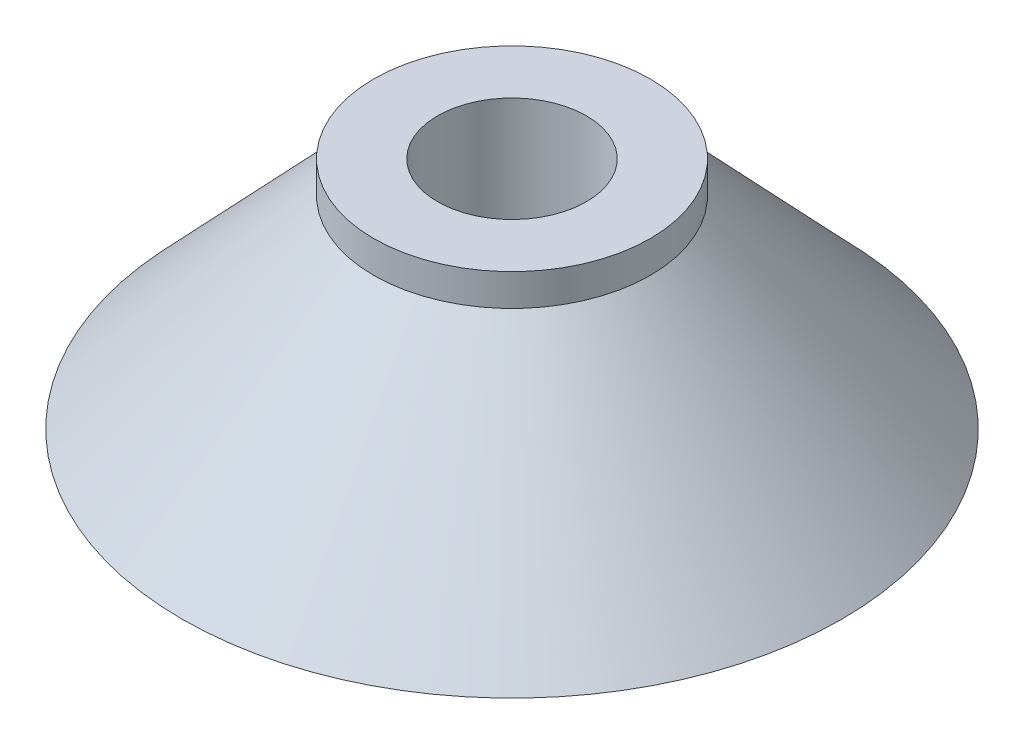
ISO-10303-21;
HEADER;
FILE_DESCRIPTION(('STEP AP214'),'2;1');
FILE_NAME('part.step','',(''),(''),'','','');
FILE_SCHEMA(('AUTOMOTIVE_DESIGN { 1 0 10303 214 1 1 1 1 }'));
ENDSEC;
DATA;
#1=APPLICATION_CONTEXT('core data for automotive mechanical design processes');
#2=APPLICATION_PROTOCOL_DEFINITION('international standard','automotive_design',2000,#1);
#3=PRODUCT_CONTEXT('',#1,'mechanical');
#4=PRODUCT('Part','Part','',(#3));
#5=PRODUCT_RELATED_PRODUCT_CATEGORY('part','',(#4));
#6=PRODUCT_DEFINITION_FORMATION('','',#4);
#7=PRODUCT_DEFINITION_CONTEXT('part definition',#1,'design');
#8=PRODUCT_DEFINITION('design','',#6,#7);
#9=PRODUCT_DEFINITION_SHAPE('','',#8);
#10=(LENGTH_UNIT() NAMED_UNIT(*) SI_UNIT(.MILLI.,.METRE.));
#11=(NAMED_UNIT(*) PLANE_ANGLE_UNIT() SI_UNIT($,.RADIAN.));
#12=(NAMED_UNIT(*) SI_UNIT($,.STERADIAN.) SOLID_ANGLE_UNIT());
#13=UNCERTAINTY_MEASURE_WITH_UNIT(LENGTH_MEASURE(1.E-05),#10,'distance_accuracy_value','');
#14=(GEOMETRIC_REPRESENTATION_CONTEXT(3) GLOBAL_UNCERTAINTY_ASSIGNED_CONTEXT((#13)) GLOBAL_UNIT_ASSIGNED_CONTEXT((#10,
#11,#12)) REPRESENTATION_CONTEXT('',''));
#15=CARTESIAN_POINT('',(0.,0.,0.));
#16=DIRECTION('',(0.,0.,1.));
#17=DIRECTION('',(1.,0.,0.));
#18=AXIS2_PLACEMENT_3D('',#15,#16,#17);
#19=CARTESIAN_POINT('',(0.,0.,0.));
#20=DIRECTION('',(0.,-1.,0.));
#21=DIRECTION('',(0.,0.,-1.));
#22=AXIS2_PLACEMENT_3D('',#19,#20,#21);
#23=CYLINDRICAL_SURFACE('',#22,3.25);
#24=CARTESIAN_POINT('',(0.,4.75,0.));
#25=DIRECTION('',(0.,-1.,0.));
#26=DIRECTION('',(0.,0.,-1.));
#27=AXIS2_PLACEMENT_3D('',#24,#25,#26);
#28=CIRCLE('',#27,3.25);
#29=CARTESIAN_POINT('',(0.,4.75,-3.25));
#30=VERTEX_POINT('',#29);
#31=EDGE_CURVE('E52',#30,#30,#28,.T.);
#32=ORIENTED_EDGE('',*,*,#31,.F.);
#33=EDGE_LOOP('',(#32));
#34=FACE_BOUND('',#33,.T.);
#35=CARTESIAN_POINT('',(0.,5.5,0.));
#36=DIRECTION('',(0.,-1.,0.));
#37=DIRECTION('',(0.,0.,-1.));
#38=AXIS2_PLACEMENT_3D('',#35,#36,#37);
#39=CIRCLE('',#38,3.25);
#40=CARTESIAN_POINT('',(0.,5.5,-3.25));
#41=VERTEX_POINT('',#40);
#42=EDGE_CURVE('E10',#41,#41,#39,.T.);
#43=ORIENTED_EDGE('',*,*,#42,.T.);
#44=EDGE_LOOP('',(#43));
#45=FACE_BOUND('',#44,.T.);
#46=ADVANCED_FACE('F33',(#34,#45),#23,.T.);
#47=CARTESIAN_POINT('',(0.,5.5,0.));
#48=DIRECTION('',(0.,-1.,0.));
#49=DIRECTION('',(0.,0.,-1.));
#50=AXIS2_PLACEMENT_3D('',#47,#48,#49);
#51=PLANE('',#50);
#52=ORIENTED_EDGE('',*,*,#42,.F.);
#53=EDGE_LOOP('',(#52));
#54=FACE_BOUND('',#53,.T.);
#55=CARTESIAN_POINT('',(0.,5.5,0.));
#56=DIRECTION('',(0.,-1.,0.));
#57=DIRECTION('',(0.,0.,-1.));
#58=AXIS2_PLACEMENT_3D('',#55,#56,#57);
#59=CIRCLE('',#58,1.75);
#60=CARTESIAN_POINT('',(0.,5.5,-1.75));
#61=VERTEX_POINT('',#60);
#62=EDGE_CURVE('E39',#61,#61,#59,.T.);
#63=ORIENTED_EDGE('',*,*,#62,.T.);
#64=EDGE_LOOP('',(#63));
#65=FACE_BOUND('',#64,.T.);
#66=ADVANCED_FACE('F59',(#54,#65),#51,.F.);
#67=CARTESIAN_POINT('',(0.,0.,0.));
#68=DIRECTION('',(0.,-1.,0.));
#69=DIRECTION('',(0.,0.,-1.));
#70=AXIS2_PLACEMENT_3D('',#67,#68,#69);
#71=CYLINDRICAL_SURFACE('',#70,1.75);
#72=CARTESIAN_POINT('',(0.,0.,0.));
#73=DIRECTION('',(0.,-1.,0.));
#74=DIRECTION('',(0.,0.,-1.));
#75=AXIS2_PLACEMENT_3D('',#72,#73,#74);
#76=CIRCLE('',#75,1.75);
#77=CARTESIAN_POINT('',(0.,0.,-1.75));
#78=VERTEX_POINT('',#77);
#79=EDGE_CURVE('E43',#78,#78,#76,.T.);
#80=ORIENTED_EDGE('',*,*,#79,.T.);
#81=EDGE_LOOP('',(#80));
#82=FACE_BOUND('',#81,.T.);
#83=ORIENTED_EDGE('',*,*,#62,.F.);
#84=EDGE_LOOP('',(#83));
#85=FACE_BOUND('',#84,.T.);
#86=ADVANCED_FACE('F63',(#82,#85),#71,.F.);
#87=CARTESIAN_POINT('',(0.,0.,0.));
#88=DIRECTION('',(0.,-1.,0.));
#89=DIRECTION('',(0.,0.,-1.));
#90=AXIS2_PLACEMENT_3D('',#87,#88,#89);
#91=PLANE('',#90);
#92=CARTESIAN_POINT('',(0.,0.,0.));
#93=DIRECTION('',(0.,-1.,0.));
#94=DIRECTION('',(0.,0.,-1.));
#95=AXIS2_PLACEMENT_3D('',#92,#93,#94);
#96=CIRCLE('',#95,7.75);
#97=CARTESIAN_POINT('',(0.,0.,-7.75));
#98=VERTEX_POINT('',#97);
#99=EDGE_CURVE('E47',#98,#98,#96,.T.);
#100=ORIENTED_EDGE('',*,*,#99,.T.);
#101=EDGE_LOOP('',(#100));
#102=FACE_BOUND('',#101,.T.);
#103=ORIENTED_EDGE('',*,*,#79,.F.);
#104=EDGE_LOOP('',(#103));
#105=FACE_BOUND('',#104,.T.);
#106=ADVANCED_FACE('F68',(#102,#105),#91,.T.);
#107=CARTESIAN_POINT('',(0.,4.75,0.));
#108=DIRECTION('',(0.,-1.,0.));
#109=DIRECTION('',(0.,0.,-1.));
#110=AXIS2_PLACEMENT_3D('',#107,#108,#109);
#111=CONICAL_SURFACE('',#110,3.25,0.758377714210184);
#112=ORIENTED_EDGE('',*,*,#99,.F.);
#113=EDGE_LOOP('',(#112));
#114=FACE_BOUND('',#113,.T.);
#115=ORIENTED_EDGE('',*,*,#31,.T.);
#116=EDGE_LOOP('',(#115));
#117=FACE_BOUND('',#116,.T.);
#118=ADVANCED_FACE('F56',(#114,#117),#111,.T.);
#119=CLOSED_SHELL('',(#46,#66,#86,#106,#118));
#120=MANIFOLD_SOLID_BREP('B2',#119);
#121=ADVANCED_BREP_SHAPE_REPRESENTATION('',(#18,#120),#14);
#122=SHAPE_DEFINITION_REPRESENTATION(#9,#121);
ENDSEC;
END-ISO-10303-21;
